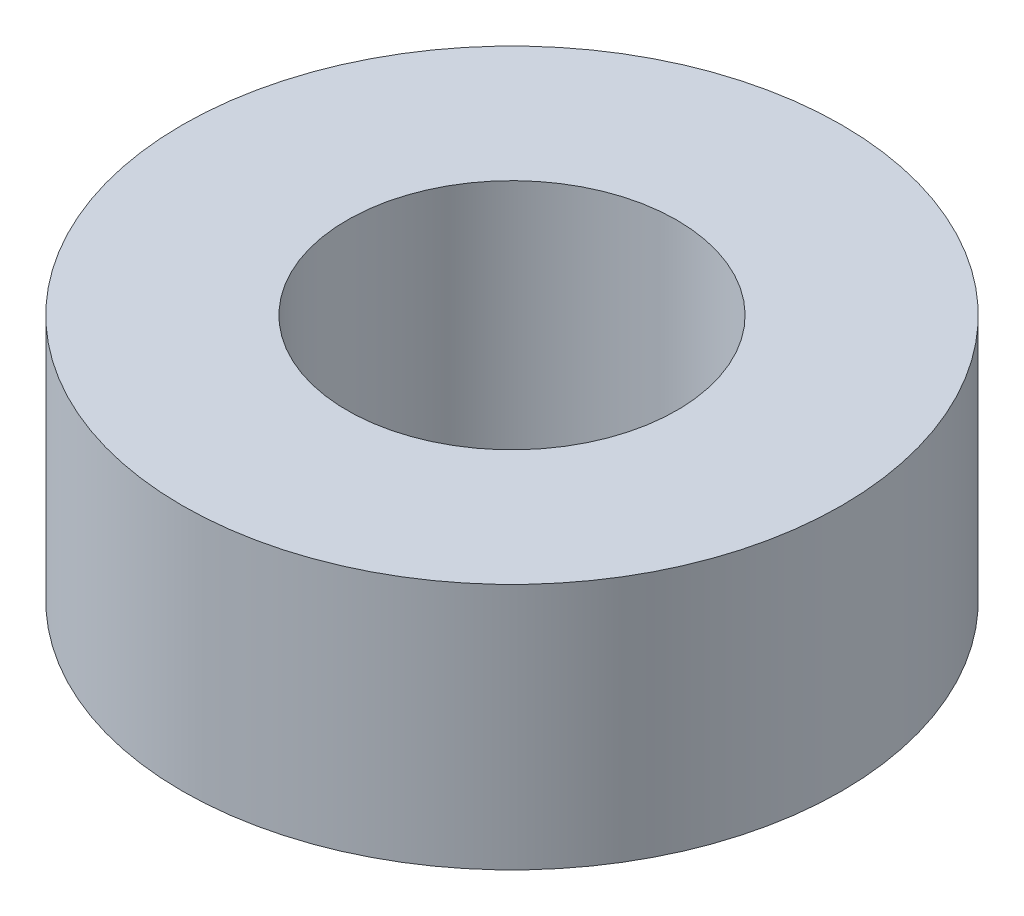
ISO-10303-21;
HEADER;
FILE_DESCRIPTION(('STEP AP214'),'2;1');
FILE_NAME('part.step','',(''),(''),'','','');
FILE_SCHEMA(('AUTOMOTIVE_DESIGN { 1 0 10303 214 1 1 1 1 }'));
ENDSEC;
DATA;
#1=APPLICATION_CONTEXT('core data for automotive mechanical design processes');
#2=APPLICATION_PROTOCOL_DEFINITION('international standard','automotive_design',2000,#1);
#3=PRODUCT_CONTEXT('',#1,'mechanical');
#4=PRODUCT('Part','Part','',(#3));
#5=PRODUCT_RELATED_PRODUCT_CATEGORY('part','',(#4));
#6=PRODUCT_DEFINITION_FORMATION('','',#4);
#7=PRODUCT_DEFINITION_CONTEXT('part definition',#1,'design');
#8=PRODUCT_DEFINITION('design','',#6,#7);
#9=PRODUCT_DEFINITION_SHAPE('','',#8);
#10=(LENGTH_UNIT() NAMED_UNIT(*) SI_UNIT(.MILLI.,.METRE.));
#11=(NAMED_UNIT(*) PLANE_ANGLE_UNIT() SI_UNIT($,.RADIAN.));
#12=(NAMED_UNIT(*) SI_UNIT($,.STERADIAN.) SOLID_ANGLE_UNIT());
#13=UNCERTAINTY_MEASURE_WITH_UNIT(LENGTH_MEASURE(1.E-05),#10,'distance_accuracy_value','');
#14=(GEOMETRIC_REPRESENTATION_CONTEXT(3) GLOBAL_UNCERTAINTY_ASSIGNED_CONTEXT((#13)) GLOBAL_UNIT_ASSIGNED_CONTEXT((#10,
#11,#12)) REPRESENTATION_CONTEXT('',''));
#15=CARTESIAN_POINT('',(0.,0.,0.));
#16=DIRECTION('',(0.,0.,1.));
#17=DIRECTION('',(1.,0.,0.));
#18=AXIS2_PLACEMENT_3D('',#15,#16,#17);
#19=CARTESIAN_POINT('',(0.,0.8,0.));
#20=DIRECTION('',(0.,-1.,0.));
#21=DIRECTION('',(0.,0.,-1.));
#22=AXIS2_PLACEMENT_3D('',#19,#20,#21);
#23=CYLINDRICAL_SURFACE('',#22,2.);
#24=CARTESIAN_POINT('',(0.,-2.5,0.));
#25=DIRECTION('',(0.,-1.,0.));
#26=DIRECTION('',(0.,0.,-1.));
#27=AXIS2_PLACEMENT_3D('',#24,#25,#26);
#28=CIRCLE('',#27,2.);
#29=CARTESIAN_POINT('',(0.,-2.5,-2.));
#30=VERTEX_POINT('',#29);
#31=EDGE_CURVE('E10',#30,#30,#28,.T.);
#32=ORIENTED_EDGE('',*,*,#31,.T.);
#33=EDGE_LOOP('',(#32));
#34=FACE_BOUND('',#33,.T.);
#35=CARTESIAN_POINT('',(0.,0.5,0.));
#36=DIRECTION('',(0.,-1.,0.));
#37=DIRECTION('',(0.,0.,-1.));
#38=AXIS2_PLACEMENT_3D('',#35,#36,#37);
#39=CIRCLE('',#38,2.);
#40=CARTESIAN_POINT('',(0.,0.5,-2.));
#41=VERTEX_POINT('',#40);
#42=EDGE_CURVE('E54',#41,#41,#39,.T.);
#43=ORIENTED_EDGE('',*,*,#42,.F.);
#44=EDGE_LOOP('',(#43));
#45=FACE_BOUND('',#44,.T.);
#46=ADVANCED_FACE('F37',(#34,#45),#23,.F.);
#47=CARTESIAN_POINT('',(2.,-2.5,0.));
#48=DIRECTION('',(0.,-1.,0.));
#49=DIRECTION('',(0.,0.,-1.));
#50=AXIS2_PLACEMENT_3D('',#47,#48,#49);
#51=PLANE('',#50);
#52=CARTESIAN_POINT('',(0.,-2.5,0.));
#53=DIRECTION('',(0.,-1.,0.));
#54=DIRECTION('',(0.,0.,-1.));
#55=AXIS2_PLACEMENT_3D('',#52,#53,#54);
#56=CIRCLE('',#55,4.);
#57=CARTESIAN_POINT('',(0.,-2.5,-4.));
#58=VERTEX_POINT('',#57);
#59=EDGE_CURVE('E44',#58,#58,#56,.T.);
#60=ORIENTED_EDGE('',*,*,#59,.T.);
#61=EDGE_LOOP('',(#60));
#62=FACE_BOUND('',#61,.T.);
#63=ORIENTED_EDGE('',*,*,#31,.F.);
#64=EDGE_LOOP('',(#63));
#65=FACE_BOUND('',#64,.T.);
#66=ADVANCED_FACE('F65',(#62,#65),#51,.T.);
#67=CARTESIAN_POINT('',(0.,0.8,0.));
#68=DIRECTION('',(0.,-1.,0.));
#69=DIRECTION('',(0.,0.,-1.));
#70=AXIS2_PLACEMENT_3D('',#67,#68,#69);
#71=CYLINDRICAL_SURFACE('',#70,4.);
#72=CARTESIAN_POINT('',(0.,0.5,0.));
#73=DIRECTION('',(0.,-1.,0.));
#74=DIRECTION('',(0.,0.,-1.));
#75=AXIS2_PLACEMENT_3D('',#72,#73,#74);
#76=CIRCLE('',#75,4.);
#77=CARTESIAN_POINT('',(0.,0.5,-4.));
#78=VERTEX_POINT('',#77);
#79=EDGE_CURVE('E49',#78,#78,#76,.T.);
#80=ORIENTED_EDGE('',*,*,#79,.T.);
#81=EDGE_LOOP('',(#80));
#82=FACE_BOUND('',#81,.T.);
#83=ORIENTED_EDGE('',*,*,#59,.F.);
#84=EDGE_LOOP('',(#83));
#85=FACE_BOUND('',#84,.T.);
#86=ADVANCED_FACE('F69',(#82,#85),#71,.T.);
#87=CARTESIAN_POINT('',(4.,0.5,0.));
#88=DIRECTION('',(0.,1.,0.));
#89=DIRECTION('',(0.,0.,1.));
#90=AXIS2_PLACEMENT_3D('',#87,#88,#89);
#91=PLANE('',#90);
#92=ORIENTED_EDGE('',*,*,#42,.T.);
#93=EDGE_LOOP('',(#92));
#94=FACE_BOUND('',#93,.T.);
#95=ORIENTED_EDGE('',*,*,#79,.F.);
#96=EDGE_LOOP('',(#95));
#97=FACE_BOUND('',#96,.T.);
#98=ADVANCED_FACE('F61',(#94,#97),#91,.T.);
#99=CLOSED_SHELL('',(#46,#66,#86,#98));
#100=MANIFOLD_SOLID_BREP('B2',#99);
#101=ADVANCED_BREP_SHAPE_REPRESENTATION('',(#18,#100),#14);
#102=SHAPE_DEFINITION_REPRESENTATION(#9,#101);
ENDSEC;
END-ISO-10303-21;
